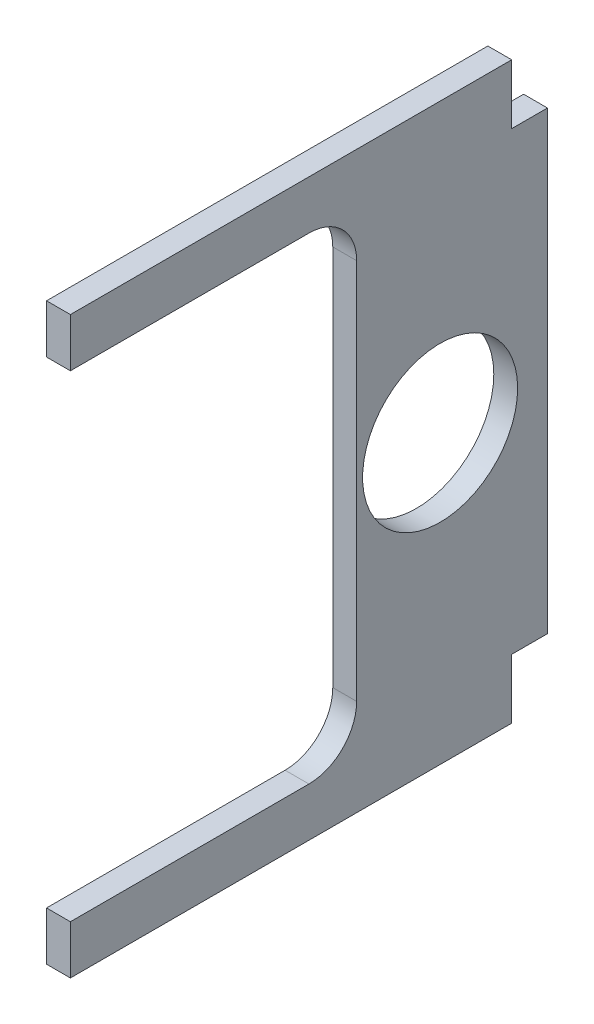
ISO-10303-21;
HEADER;
FILE_DESCRIPTION(('STEP AP214'),'2;1');
FILE_NAME('part.step','',(''),(''),'','','');
FILE_SCHEMA(('AUTOMOTIVE_DESIGN { 1 0 10303 214 1 1 1 1 }'));
ENDSEC;
DATA;
#1=APPLICATION_CONTEXT('core data for automotive mechanical design processes');
#2=APPLICATION_PROTOCOL_DEFINITION('international standard','automotive_design',2000,#1);
#3=PRODUCT_CONTEXT('',#1,'mechanical');
#4=PRODUCT('Part','Part','',(#3));
#5=PRODUCT_RELATED_PRODUCT_CATEGORY('part','',(#4));
#6=PRODUCT_DEFINITION_FORMATION('','',#4);
#7=PRODUCT_DEFINITION_CONTEXT('part definition',#1,'design');
#8=PRODUCT_DEFINITION('design','',#6,#7);
#9=PRODUCT_DEFINITION_SHAPE('','',#8);
#10=(LENGTH_UNIT() NAMED_UNIT(*) SI_UNIT(.MILLI.,.METRE.));
#11=(NAMED_UNIT(*) PLANE_ANGLE_UNIT() SI_UNIT($,.RADIAN.));
#12=(NAMED_UNIT(*) SI_UNIT($,.STERADIAN.) SOLID_ANGLE_UNIT());
#13=UNCERTAINTY_MEASURE_WITH_UNIT(LENGTH_MEASURE(1.E-05),#10,'distance_accuracy_value','');
#14=(GEOMETRIC_REPRESENTATION_CONTEXT(3) GLOBAL_UNCERTAINTY_ASSIGNED_CONTEXT((#13)) GLOBAL_UNIT_ASSIGNED_CONTEXT((#10,
#11,#12)) REPRESENTATION_CONTEXT('',''));
#15=CARTESIAN_POINT('',(0.,0.,0.));
#16=DIRECTION('',(0.,0.,1.));
#17=DIRECTION('',(1.,0.,0.));
#18=AXIS2_PLACEMENT_3D('',#15,#16,#17);
#19=CARTESIAN_POINT('',(-241.,-19.0864325766778,51.2252224848499));
#20=DIRECTION('',(1.,0.,0.));
#21=DIRECTION('',(0.,0.,-1.));
#22=AXIS2_PLACEMENT_3D('',#19,#20,#21);
#23=PLANE('',#22);
#24=CARTESIAN_POINT('',(-241.,0.,6.));
#25=DIRECTION('',(1.,0.,0.));
#26=DIRECTION('',(0.,0.,-1.));
#27=AXIS2_PLACEMENT_3D('',#24,#25,#26);
#28=CIRCLE('',#27,6.5);
#29=CARTESIAN_POINT('',(-241.,0.,-0.5));
#30=VERTEX_POINT('',#29);
#31=EDGE_CURVE('E137',#30,#30,#28,.T.);
#32=ORIENTED_EDGE('',*,*,#31,.T.);
#33=EDGE_LOOP('',(#32));
#34=FACE_BOUND('',#33,.T.);
#35=DIRECTION('',(0.,0.,1.));
#36=VECTOR('',#35,1.);
#37=CARTESIAN_POINT('',(-241.,-20.,51.2252224848499));
#38=LINE('',#37,#36);
#39=CARTESIAN_POINT('',(-241.,-20.,17.));
#40=VERTEX_POINT('',#39);
#41=CARTESIAN_POINT('',(-241.,-20.,37.));
#42=VERTEX_POINT('',#41);
#43=EDGE_CURVE('E141',#40,#42,#38,.T.);
#44=ORIENTED_EDGE('',*,*,#43,.F.);
#45=CARTESIAN_POINT('',(-241.,-16.,17.));
#46=DIRECTION('',(1.,0.,0.));
#47=DIRECTION('',(0.,0.,-1.));
#48=AXIS2_PLACEMENT_3D('',#45,#46,#47);
#49=CIRCLE('',#48,4.);
#50=CARTESIAN_POINT('',(-241.,-16.,13.));
#51=VERTEX_POINT('',#50);
#52=EDGE_CURVE('E11',#40,#51,#49,.T.);
#53=ORIENTED_EDGE('',*,*,#52,.T.);
#54=DIRECTION('',(0.,-1.,0.));
#55=VECTOR('',#54,1.);
#56=CARTESIAN_POINT('',(-241.,-19.0864325766778,13.));
#57=LINE('',#56,#55);
#58=CARTESIAN_POINT('',(-241.,16.,13.));
#59=VERTEX_POINT('',#58);
#60=EDGE_CURVE('E203',#59,#51,#57,.T.);
#61=ORIENTED_EDGE('',*,*,#60,.F.);
#62=CARTESIAN_POINT('',(-241.,16.,17.));
#63=DIRECTION('',(1.,0.,0.));
#64=DIRECTION('',(0.,0.,-1.));
#65=AXIS2_PLACEMENT_3D('',#62,#63,#64);
#66=CIRCLE('',#65,4.);
#67=CARTESIAN_POINT('',(-241.,20.,17.));
#68=VERTEX_POINT('',#67);
#69=EDGE_CURVE('E209',#59,#68,#66,.T.);
#70=ORIENTED_EDGE('',*,*,#69,.T.);
#71=DIRECTION('',(0.,0.,1.));
#72=VECTOR('',#71,1.);
#73=CARTESIAN_POINT('',(-241.,20.,51.2252224848499));
#74=LINE('',#73,#72);
#75=CARTESIAN_POINT('',(-241.,20.,37.));
#76=VERTEX_POINT('',#75);
#77=EDGE_CURVE('E162',#68,#76,#74,.T.);
#78=ORIENTED_EDGE('',*,*,#77,.T.);
#79=DIRECTION('',(0.,-1.,0.));
#80=VECTOR('',#79,1.);
#81=CARTESIAN_POINT('',(-241.,24.0864325766779,37.));
#82=LINE('',#81,#80);
#83=CARTESIAN_POINT('',(-241.,24.0864325766779,37.));
#84=VERTEX_POINT('',#83);
#85=EDGE_CURVE('E253',#84,#76,#82,.T.);
#86=ORIENTED_EDGE('',*,*,#85,.F.);
#87=DIRECTION('',(0.,0.,1.));
#88=VECTOR('',#87,1.);
#89=CARTESIAN_POINT('',(-241.,24.0864325766779,0.));
#90=LINE('',#89,#88);
#91=CARTESIAN_POINT('',(-241.,24.0864325766779,0.));
#92=VERTEX_POINT('',#91);
#93=EDGE_CURVE('E165',#92,#84,#90,.T.);
#94=ORIENTED_EDGE('',*,*,#93,.F.);
#95=DIRECTION('',(0.,-1.,0.));
#96=VECTOR('',#95,1.);
#97=CARTESIAN_POINT('',(-241.,24.0864325766779,0.));
#98=LINE('',#97,#96);
#99=CARTESIAN_POINT('',(-241.,19.0864325766779,0.));
#100=VERTEX_POINT('',#99);
#101=EDGE_CURVE('E174',#92,#100,#98,.T.);
#102=ORIENTED_EDGE('',*,*,#101,.T.);
#103=DIRECTION('',(0.,0.,-1.));
#104=VECTOR('',#103,1.);
#105=CARTESIAN_POINT('',(-241.,19.0864325766779,51.2252224848499));
#106=LINE('',#105,#104);
#107=CARTESIAN_POINT('',(-241.,19.0864325766779,-3.));
#108=VERTEX_POINT('',#107);
#109=EDGE_CURVE('E183',#100,#108,#106,.T.);
#110=ORIENTED_EDGE('',*,*,#109,.T.);
#111=DIRECTION('',(0.,-1.,0.));
#112=VECTOR('',#111,1.);
#113=CARTESIAN_POINT('',(-241.,-19.0864325766778,-3.));
#114=LINE('',#113,#112);
#115=CARTESIAN_POINT('',(-241.,-19.0864325766778,-3.00000000000002));
#116=VERTEX_POINT('',#115);
#117=EDGE_CURVE('E247',#108,#116,#114,.T.);
#118=ORIENTED_EDGE('',*,*,#117,.T.);
#119=DIRECTION('',(0.,0.,-1.));
#120=VECTOR('',#119,1.);
#121=CARTESIAN_POINT('',(-241.,-19.0864325766778,51.2252224848499));
#122=LINE('',#121,#120);
#123=CARTESIAN_POINT('',(-241.,-19.0864325766778,0.));
#124=VERTEX_POINT('',#123);
#125=EDGE_CURVE('E224',#124,#116,#122,.T.);
#126=ORIENTED_EDGE('',*,*,#125,.F.);
#127=DIRECTION('',(0.,1.,0.));
#128=VECTOR('',#127,1.);
#129=CARTESIAN_POINT('',(-241.,-24.0864325766779,0.));
#130=LINE('',#129,#128);
#131=CARTESIAN_POINT('',(-241.,-24.0864325766779,0.));
#132=VERTEX_POINT('',#131);
#133=EDGE_CURVE('E152',#132,#124,#130,.T.);
#134=ORIENTED_EDGE('',*,*,#133,.F.);
#135=DIRECTION('',(0.,0.,1.));
#136=VECTOR('',#135,1.);
#137=CARTESIAN_POINT('',(-241.,-24.0864325766779,0.));
#138=LINE('',#137,#136);
#139=CARTESIAN_POINT('',(-241.,-24.0864325766779,37.));
#140=VERTEX_POINT('',#139);
#141=EDGE_CURVE('E281',#132,#140,#138,.T.);
#142=ORIENTED_EDGE('',*,*,#141,.T.);
#143=DIRECTION('',(0.,1.,0.));
#144=VECTOR('',#143,1.);
#145=CARTESIAN_POINT('',(-241.,-24.0864325766779,37.));
#146=LINE('',#145,#144);
#147=EDGE_CURVE('E150',#140,#42,#146,.T.);
#148=ORIENTED_EDGE('',*,*,#147,.T.);
#149=EDGE_LOOP('',(#44,#53,#61,#70,#78,#86,#94,#102,#110,#118,#126,#134,#142,#148));
#150=FACE_BOUND('',#149,.T.);
#151=ADVANCED_FACE('F33',(#34,#150),#23,.F.);
#152=CARTESIAN_POINT('',(-239.,19.0864325766779,51.2252224848499));
#153=DIRECTION('',(-1.,0.,0.));
#154=DIRECTION('',(0.,0.,1.));
#155=AXIS2_PLACEMENT_3D('',#152,#153,#154);
#156=PLANE('',#155);
#157=CARTESIAN_POINT('',(-239.,0.,6.));
#158=DIRECTION('',(1.,0.,0.));
#159=DIRECTION('',(0.,0.,-1.));
#160=AXIS2_PLACEMENT_3D('',#157,#158,#159);
#161=CIRCLE('',#160,6.5);
#162=CARTESIAN_POINT('',(-239.,0.,-0.5));
#163=VERTEX_POINT('',#162);
#164=EDGE_CURVE('E459',#163,#163,#161,.T.);
#165=ORIENTED_EDGE('',*,*,#164,.F.);
#166=EDGE_LOOP('',(#165));
#167=FACE_BOUND('',#166,.T.);
#168=DIRECTION('',(0.,1.,0.));
#169=VECTOR('',#168,1.);
#170=CARTESIAN_POINT('',(-239.,19.0864325766779,13.));
#171=LINE('',#170,#169);
#172=CARTESIAN_POINT('',(-239.,-16.,13.));
#173=VERTEX_POINT('',#172);
#174=CARTESIAN_POINT('',(-239.,16.,13.));
#175=VERTEX_POINT('',#174);
#176=EDGE_CURVE('E200',#173,#175,#171,.T.);
#177=ORIENTED_EDGE('',*,*,#176,.F.);
#178=CARTESIAN_POINT('',(-239.,-16.,17.));
#179=DIRECTION('',(-1.,0.,0.));
#180=DIRECTION('',(0.,0.,1.));
#181=AXIS2_PLACEMENT_3D('',#178,#179,#180);
#182=CIRCLE('',#181,4.);
#183=CARTESIAN_POINT('',(-239.,-20.,17.));
#184=VERTEX_POINT('',#183);
#185=EDGE_CURVE('E41',#173,#184,#182,.T.);
#186=ORIENTED_EDGE('',*,*,#185,.T.);
#187=DIRECTION('',(0.,0.,1.));
#188=VECTOR('',#187,1.);
#189=CARTESIAN_POINT('',(-239.,-20.,13.));
#190=LINE('',#189,#188);
#191=CARTESIAN_POINT('',(-239.,-20.,37.));
#192=VERTEX_POINT('',#191);
#193=EDGE_CURVE('E129',#184,#192,#190,.T.);
#194=ORIENTED_EDGE('',*,*,#193,.T.);
#195=DIRECTION('',(0.,1.,0.));
#196=VECTOR('',#195,1.);
#197=CARTESIAN_POINT('',(-239.,-24.0864325766779,37.));
#198=LINE('',#197,#196);
#199=CARTESIAN_POINT('',(-239.,-24.0864325766779,37.));
#200=VERTEX_POINT('',#199);
#201=EDGE_CURVE('E134',#200,#192,#198,.T.);
#202=ORIENTED_EDGE('',*,*,#201,.F.);
#203=DIRECTION('',(0.,0.,-1.));
#204=VECTOR('',#203,1.);
#205=CARTESIAN_POINT('',(-239.,-24.0864325766779,0.));
#206=LINE('',#205,#204);
#207=CARTESIAN_POINT('',(-239.,-24.0864325766779,0.));
#208=VERTEX_POINT('',#207);
#209=EDGE_CURVE('E287',#200,#208,#206,.T.);
#210=ORIENTED_EDGE('',*,*,#209,.T.);
#211=DIRECTION('',(0.,1.,0.));
#212=VECTOR('',#211,1.);
#213=CARTESIAN_POINT('',(-239.,-24.0864325766779,0.));
#214=LINE('',#213,#212);
#215=CARTESIAN_POINT('',(-239.,-19.0864325766779,0.));
#216=VERTEX_POINT('',#215);
#217=EDGE_CURVE('E149',#208,#216,#214,.T.);
#218=ORIENTED_EDGE('',*,*,#217,.T.);
#219=DIRECTION('',(0.,0.,-1.));
#220=VECTOR('',#219,1.);
#221=CARTESIAN_POINT('',(-239.,-19.0864325766778,51.2252224848499));
#222=LINE('',#221,#220);
#223=CARTESIAN_POINT('',(-239.,-19.0864325766778,-3.));
#224=VERTEX_POINT('',#223);
#225=EDGE_CURVE('E204',#216,#224,#222,.T.);
#226=ORIENTED_EDGE('',*,*,#225,.T.);
#227=DIRECTION('',(0.,1.,0.));
#228=VECTOR('',#227,1.);
#229=CARTESIAN_POINT('',(-239.,19.0864325766779,-3.));
#230=LINE('',#229,#228);
#231=CARTESIAN_POINT('',(-239.,19.0864325766779,-3.));
#232=VERTEX_POINT('',#231);
#233=EDGE_CURVE('E241',#224,#232,#230,.T.);
#234=ORIENTED_EDGE('',*,*,#233,.T.);
#235=DIRECTION('',(0.,0.,-1.));
#236=VECTOR('',#235,1.);
#237=CARTESIAN_POINT('',(-239.,19.0864325766779,51.2252224848499));
#238=LINE('',#237,#236);
#239=CARTESIAN_POINT('',(-239.,19.0864325766779,0.));
#240=VERTEX_POINT('',#239);
#241=EDGE_CURVE('E235',#240,#232,#238,.T.);
#242=ORIENTED_EDGE('',*,*,#241,.F.);
#243=DIRECTION('',(0.,-1.,0.));
#244=VECTOR('',#243,1.);
#245=CARTESIAN_POINT('',(-239.,24.0864325766779,0.));
#246=LINE('',#245,#244);
#247=CARTESIAN_POINT('',(-239.,24.0864325766779,0.));
#248=VERTEX_POINT('',#247);
#249=EDGE_CURVE('E188',#248,#240,#246,.T.);
#250=ORIENTED_EDGE('',*,*,#249,.F.);
#251=DIRECTION('',(0.,0.,-1.));
#252=VECTOR('',#251,1.);
#253=CARTESIAN_POINT('',(-239.,24.0864325766779,0.));
#254=LINE('',#253,#252);
#255=CARTESIAN_POINT('',(-239.,24.0864325766779,37.));
#256=VERTEX_POINT('',#255);
#257=EDGE_CURVE('E170',#256,#248,#254,.T.);
#258=ORIENTED_EDGE('',*,*,#257,.F.);
#259=DIRECTION('',(0.,-1.,0.));
#260=VECTOR('',#259,1.);
#261=CARTESIAN_POINT('',(-239.,24.0864325766779,37.));
#262=LINE('',#261,#260);
#263=CARTESIAN_POINT('',(-239.,20.,37.));
#264=VERTEX_POINT('',#263);
#265=EDGE_CURVE('E177',#256,#264,#262,.T.);
#266=ORIENTED_EDGE('',*,*,#265,.T.);
#267=DIRECTION('',(0.,0.,1.));
#268=VECTOR('',#267,1.);
#269=CARTESIAN_POINT('',(-239.,20.,13.));
#270=LINE('',#269,#268);
#271=CARTESIAN_POINT('',(-239.,20.,17.));
#272=VERTEX_POINT('',#271);
#273=EDGE_CURVE('E157',#272,#264,#270,.T.);
#274=ORIENTED_EDGE('',*,*,#273,.F.);
#275=CARTESIAN_POINT('',(-239.,16.,17.));
#276=DIRECTION('',(-1.,0.,0.));
#277=DIRECTION('',(0.,0.,1.));
#278=AXIS2_PLACEMENT_3D('',#275,#276,#277);
#279=CIRCLE('',#278,4.);
#280=EDGE_CURVE('E213',#272,#175,#279,.T.);
#281=ORIENTED_EDGE('',*,*,#280,.T.);
#282=EDGE_LOOP('',(#177,#186,#194,#202,#210,#218,#226,#234,#242,#250,#258,#266,#274,#281));
#283=FACE_BOUND('',#282,.T.);
#284=ADVANCED_FACE('F131',(#167,#283),#156,.F.);
#285=CARTESIAN_POINT('',(-241.,-24.0864325766779,37.));
#286=DIRECTION('',(0.,0.,1.));
#287=DIRECTION('',(1.,0.,0.));
#288=AXIS2_PLACEMENT_3D('',#285,#286,#287);
#289=PLANE('',#288);
#290=ORIENTED_EDGE('',*,*,#201,.T.);
#291=DIRECTION('',(1.,0.,0.));
#292=VECTOR('',#291,1.);
#293=CARTESIAN_POINT('',(-249.,-20.,37.));
#294=LINE('',#293,#292);
#295=EDGE_CURVE('E136',#42,#192,#294,.T.);
#296=ORIENTED_EDGE('',*,*,#295,.F.);
#297=ORIENTED_EDGE('',*,*,#147,.F.);
#298=DIRECTION('',(1.,0.,0.));
#299=VECTOR('',#298,1.);
#300=CARTESIAN_POINT('',(-241.,-24.0864325766779,37.));
#301=LINE('',#300,#299);
#302=EDGE_CURVE('E148',#140,#200,#301,.T.);
#303=ORIENTED_EDGE('',*,*,#302,.T.);
#304=EDGE_LOOP('',(#290,#296,#297,#303));
#305=FACE_BOUND('',#304,.T.);
#306=ADVANCED_FACE('F146',(#305),#289,.T.);
#307=CARTESIAN_POINT('',(-241.,19.0864325766779,51.2252224848499));
#308=DIRECTION('',(0.,-1.,0.));
#309=DIRECTION('',(0.,0.,-1.));
#310=AXIS2_PLACEMENT_3D('',#307,#308,#309);
#311=PLANE('',#310);
#312=DIRECTION('',(-1.,0.,0.));
#313=VECTOR('',#312,1.);
#314=CARTESIAN_POINT('',(-241.,19.0864325766779,0.));
#315=LINE('',#314,#313);
#316=EDGE_CURVE('E164',#240,#100,#315,.T.);
#317=ORIENTED_EDGE('',*,*,#316,.F.);
#318=ORIENTED_EDGE('',*,*,#241,.T.);
#319=DIRECTION('',(-1.,0.,0.));
#320=VECTOR('',#319,1.);
#321=CARTESIAN_POINT('',(-241.,19.0864325766779,-3.));
#322=LINE('',#321,#320);
#323=EDGE_CURVE('E236',#232,#108,#322,.T.);
#324=ORIENTED_EDGE('',*,*,#323,.T.);
#325=ORIENTED_EDGE('',*,*,#109,.F.);
#326=EDGE_LOOP('',(#317,#318,#324,#325));
#327=FACE_BOUND('',#326,.T.);
#328=ADVANCED_FACE('F323',(#327),#311,.F.);
#329=CARTESIAN_POINT('',(-239.,-19.0864325766778,51.2252224848499));
#330=DIRECTION('',(0.,1.,0.));
#331=DIRECTION('',(0.,0.,1.));
#332=AXIS2_PLACEMENT_3D('',#329,#330,#331);
#333=PLANE('',#332);
#334=ORIENTED_EDGE('',*,*,#225,.F.);
#335=DIRECTION('',(-1.,0.,0.));
#336=VECTOR('',#335,1.);
#337=CARTESIAN_POINT('',(-241.,-19.0864325766779,0.));
#338=LINE('',#337,#336);
#339=EDGE_CURVE('E278',#216,#124,#338,.T.);
#340=ORIENTED_EDGE('',*,*,#339,.T.);
#341=ORIENTED_EDGE('',*,*,#125,.T.);
#342=DIRECTION('',(1.,0.,0.));
#343=VECTOR('',#342,1.);
#344=CARTESIAN_POINT('',(-239.,-19.0864325766778,-3.));
#345=LINE('',#344,#343);
#346=EDGE_CURVE('E244',#116,#224,#345,.T.);
#347=ORIENTED_EDGE('',*,*,#346,.T.);
#348=EDGE_LOOP('',(#334,#340,#341,#347));
#349=FACE_BOUND('',#348,.T.);
#350=ADVANCED_FACE('F298',(#349),#333,.F.);
#351=CARTESIAN_POINT('',(-205.,0.,13.));
#352=DIRECTION('',(0.,0.,1.));
#353=DIRECTION('',(1.,0.,0.));
#354=AXIS2_PLACEMENT_3D('',#351,#352,#353);
#355=PLANE('',#354);
#356=ORIENTED_EDGE('',*,*,#60,.T.);
#357=DIRECTION('',(1.,0.,0.));
#358=VECTOR('',#357,1.);
#359=CARTESIAN_POINT('',(-239.,-16.,13.));
#360=LINE('',#359,#358);
#361=EDGE_CURVE('E206',#51,#173,#360,.T.);
#362=ORIENTED_EDGE('',*,*,#361,.T.);
#363=ORIENTED_EDGE('',*,*,#176,.T.);
#364=DIRECTION('',(1.,0.,0.));
#365=VECTOR('',#364,1.);
#366=CARTESIAN_POINT('',(-205.,16.,13.));
#367=LINE('',#366,#365);
#368=EDGE_CURVE('E220',#175,#59,#367,.F.);
#369=ORIENTED_EDGE('',*,*,#368,.T.);
#370=EDGE_LOOP('',(#356,#362,#363,#369));
#371=FACE_BOUND('',#370,.T.);
#372=ADVANCED_FACE('F273',(#371),#355,.T.);
#373=CARTESIAN_POINT('',(0.,0.,-3.));
#374=DIRECTION('',(0.,0.,-1.));
#375=DIRECTION('',(0.,-1.,0.));
#376=AXIS2_PLACEMENT_3D('',#373,#374,#375);
#377=PLANE('',#376);
#378=ORIENTED_EDGE('',*,*,#323,.F.);
#379=ORIENTED_EDGE('',*,*,#233,.F.);
#380=ORIENTED_EDGE('',*,*,#346,.F.);
#381=ORIENTED_EDGE('',*,*,#117,.F.);
#382=EDGE_LOOP('',(#378,#379,#380,#381));
#383=FACE_BOUND('',#382,.T.);
#384=ADVANCED_FACE('F301',(#383),#377,.T.);
#385=CARTESIAN_POINT('',(-241.,24.0864325766779,37.));
#386=DIRECTION('',(0.,0.,-1.));
#387=DIRECTION('',(-1.,0.,0.));
#388=AXIS2_PLACEMENT_3D('',#385,#386,#387);
#389=PLANE('',#388);
#390=ORIENTED_EDGE('',*,*,#85,.T.);
#391=DIRECTION('',(1.,0.,0.));
#392=VECTOR('',#391,1.);
#393=CARTESIAN_POINT('',(-249.,20.,37.));
#394=LINE('',#393,#392);
#395=EDGE_CURVE('E159',#76,#264,#394,.T.);
#396=ORIENTED_EDGE('',*,*,#395,.T.);
#397=ORIENTED_EDGE('',*,*,#265,.F.);
#398=DIRECTION('',(1.,0.,0.));
#399=VECTOR('',#398,1.);
#400=CARTESIAN_POINT('',(-241.,24.0864325766779,37.));
#401=LINE('',#400,#399);
#402=EDGE_CURVE('E168',#84,#256,#401,.T.);
#403=ORIENTED_EDGE('',*,*,#402,.F.);
#404=EDGE_LOOP('',(#390,#396,#397,#403));
#405=FACE_BOUND('',#404,.T.);
#406=ADVANCED_FACE('F264',(#405),#389,.F.);
#407=CARTESIAN_POINT('',(-241.,24.0864325766779,0.));
#408=DIRECTION('',(0.,0.,1.));
#409=DIRECTION('',(1.,0.,0.));
#410=AXIS2_PLACEMENT_3D('',#407,#408,#409);
#411=PLANE('',#410);
#412=ORIENTED_EDGE('',*,*,#316,.T.);
#413=ORIENTED_EDGE('',*,*,#101,.F.);
#414=DIRECTION('',(-1.,0.,0.));
#415=VECTOR('',#414,1.);
#416=CARTESIAN_POINT('',(-241.,24.0864325766779,0.));
#417=LINE('',#416,#415);
#418=EDGE_CURVE('E172',#248,#92,#417,.T.);
#419=ORIENTED_EDGE('',*,*,#418,.F.);
#420=ORIENTED_EDGE('',*,*,#249,.T.);
#421=EDGE_LOOP('',(#412,#413,#419,#420));
#422=FACE_BOUND('',#421,.T.);
#423=ADVANCED_FACE('F308',(#422),#411,.F.);
#424=CARTESIAN_POINT('',(0.,24.0864325766779,0.));
#425=DIRECTION('',(0.,1.,0.));
#426=DIRECTION('',(0.,0.,1.));
#427=AXIS2_PLACEMENT_3D('',#424,#425,#426);
#428=PLANE('',#427);
#429=ORIENTED_EDGE('',*,*,#93,.T.);
#430=ORIENTED_EDGE('',*,*,#402,.T.);
#431=ORIENTED_EDGE('',*,*,#257,.T.);
#432=ORIENTED_EDGE('',*,*,#418,.T.);
#433=EDGE_LOOP('',(#429,#430,#431,#432));
#434=FACE_BOUND('',#433,.T.);
#435=ADVANCED_FACE('F333',(#434),#428,.T.);
#436=CARTESIAN_POINT('',(-249.,20.,13.));
#437=DIRECTION('',(0.,1.,0.));
#438=DIRECTION('',(-1.,0.,0.));
#439=AXIS2_PLACEMENT_3D('',#436,#437,#438);
#440=PLANE('',#439);
#441=ORIENTED_EDGE('',*,*,#77,.F.);
#442=DIRECTION('',(1.,0.,0.));
#443=VECTOR('',#442,1.);
#444=CARTESIAN_POINT('',(-249.,20.,17.));
#445=LINE('',#444,#443);
#446=EDGE_CURVE('E270',#68,#272,#445,.T.);
#447=ORIENTED_EDGE('',*,*,#446,.T.);
#448=ORIENTED_EDGE('',*,*,#273,.T.);
#449=ORIENTED_EDGE('',*,*,#395,.F.);
#450=EDGE_LOOP('',(#441,#447,#448,#449));
#451=FACE_BOUND('',#450,.T.);
#452=ADVANCED_FACE('F267',(#451),#440,.F.);
#453=CARTESIAN_POINT('',(-249.,16.,17.));
#454=DIRECTION('',(1.,0.,0.));
#455=DIRECTION('',(0.,1.,0.));
#456=AXIS2_PLACEMENT_3D('',#453,#454,#455);
#457=CYLINDRICAL_SURFACE('',#456,4.);
#458=ORIENTED_EDGE('',*,*,#69,.F.);
#459=ORIENTED_EDGE('',*,*,#368,.F.);
#460=ORIENTED_EDGE('',*,*,#280,.F.);
#461=ORIENTED_EDGE('',*,*,#446,.F.);
#462=EDGE_LOOP('',(#458,#459,#460,#461));
#463=FACE_BOUND('',#462,.T.);
#464=ADVANCED_FACE('F325',(#463),#457,.F.);
#465=CARTESIAN_POINT('',(-241.,-24.0864325766779,0.));
#466=DIRECTION('',(0.,0.,-1.));
#467=DIRECTION('',(-1.,0.,0.));
#468=AXIS2_PLACEMENT_3D('',#465,#466,#467);
#469=PLANE('',#468);
#470=ORIENTED_EDGE('',*,*,#339,.F.);
#471=ORIENTED_EDGE('',*,*,#217,.F.);
#472=DIRECTION('',(-1.,0.,0.));
#473=VECTOR('',#472,1.);
#474=CARTESIAN_POINT('',(-241.,-24.0864325766779,0.));
#475=LINE('',#474,#473);
#476=EDGE_CURVE('E284',#208,#132,#475,.T.);
#477=ORIENTED_EDGE('',*,*,#476,.T.);
#478=ORIENTED_EDGE('',*,*,#133,.T.);
#479=EDGE_LOOP('',(#470,#471,#477,#478));
#480=FACE_BOUND('',#479,.T.);
#481=ADVANCED_FACE('F295',(#480),#469,.T.);
#482=CARTESIAN_POINT('',(0.,-24.0864325766779,0.));
#483=DIRECTION('',(0.,-1.,0.));
#484=DIRECTION('',(0.,0.,1.));
#485=AXIS2_PLACEMENT_3D('',#482,#483,#484);
#486=PLANE('',#485);
#487=ORIENTED_EDGE('',*,*,#141,.F.);
#488=ORIENTED_EDGE('',*,*,#476,.F.);
#489=ORIENTED_EDGE('',*,*,#209,.F.);
#490=ORIENTED_EDGE('',*,*,#302,.F.);
#491=EDGE_LOOP('',(#487,#488,#489,#490));
#492=FACE_BOUND('',#491,.T.);
#493=ADVANCED_FACE('F331',(#492),#486,.T.);
#494=CARTESIAN_POINT('',(-249.,-20.,13.));
#495=DIRECTION('',(0.,1.,0.));
#496=DIRECTION('',(-1.,0.,0.));
#497=AXIS2_PLACEMENT_3D('',#494,#495,#496);
#498=PLANE('',#497);
#499=ORIENTED_EDGE('',*,*,#193,.F.);
#500=DIRECTION('',(1.,0.,0.));
#501=VECTOR('',#500,1.);
#502=CARTESIAN_POINT('',(-241.,-20.,17.));
#503=LINE('',#502,#501);
#504=EDGE_CURVE('E54',#184,#40,#503,.F.);
#505=ORIENTED_EDGE('',*,*,#504,.T.);
#506=ORIENTED_EDGE('',*,*,#43,.T.);
#507=ORIENTED_EDGE('',*,*,#295,.T.);
#508=EDGE_LOOP('',(#499,#505,#506,#507));
#509=FACE_BOUND('',#508,.T.);
#510=ADVANCED_FACE('F140',(#509),#498,.T.);
#511=CARTESIAN_POINT('',(-205.,-16.,17.));
#512=DIRECTION('',(-1.,0.,0.));
#513=DIRECTION('',(0.,-1.,0.));
#514=AXIS2_PLACEMENT_3D('',#511,#512,#513);
#515=CYLINDRICAL_SURFACE('',#514,4.);
#516=ORIENTED_EDGE('',*,*,#52,.F.);
#517=ORIENTED_EDGE('',*,*,#504,.F.);
#518=ORIENTED_EDGE('',*,*,#185,.F.);
#519=ORIENTED_EDGE('',*,*,#361,.F.);
#520=EDGE_LOOP('',(#516,#517,#518,#519));
#521=FACE_BOUND('',#520,.T.);
#522=ADVANCED_FACE('F35',(#521),#515,.F.);
#523=CARTESIAN_POINT('',(-249.,0.,6.));
#524=DIRECTION('',(1.,0.,0.));
#525=DIRECTION('',(0.,0.,-1.));
#526=AXIS2_PLACEMENT_3D('',#523,#524,#525);
#527=CYLINDRICAL_SURFACE('',#526,6.5);
#528=ORIENTED_EDGE('',*,*,#164,.T.);
#529=EDGE_LOOP('',(#528));
#530=FACE_BOUND('',#529,.T.);
#531=ORIENTED_EDGE('',*,*,#31,.F.);
#532=EDGE_LOOP('',(#531));
#533=FACE_BOUND('',#532,.T.);
#534=ADVANCED_FACE('F424',(#530,#533),#527,.F.);
#535=CLOSED_SHELL('',(#151,#284,#306,#328,#350,#372,#384,#406,#423,#435,#452,#464,#481,#493,
#510,#522,#534));
#536=MANIFOLD_SOLID_BREP('B2',#535);
#537=ADVANCED_BREP_SHAPE_REPRESENTATION('',(#18,#536),#14);
#538=SHAPE_DEFINITION_REPRESENTATION(#9,#537);
ENDSEC;
END-ISO-10303-21;
